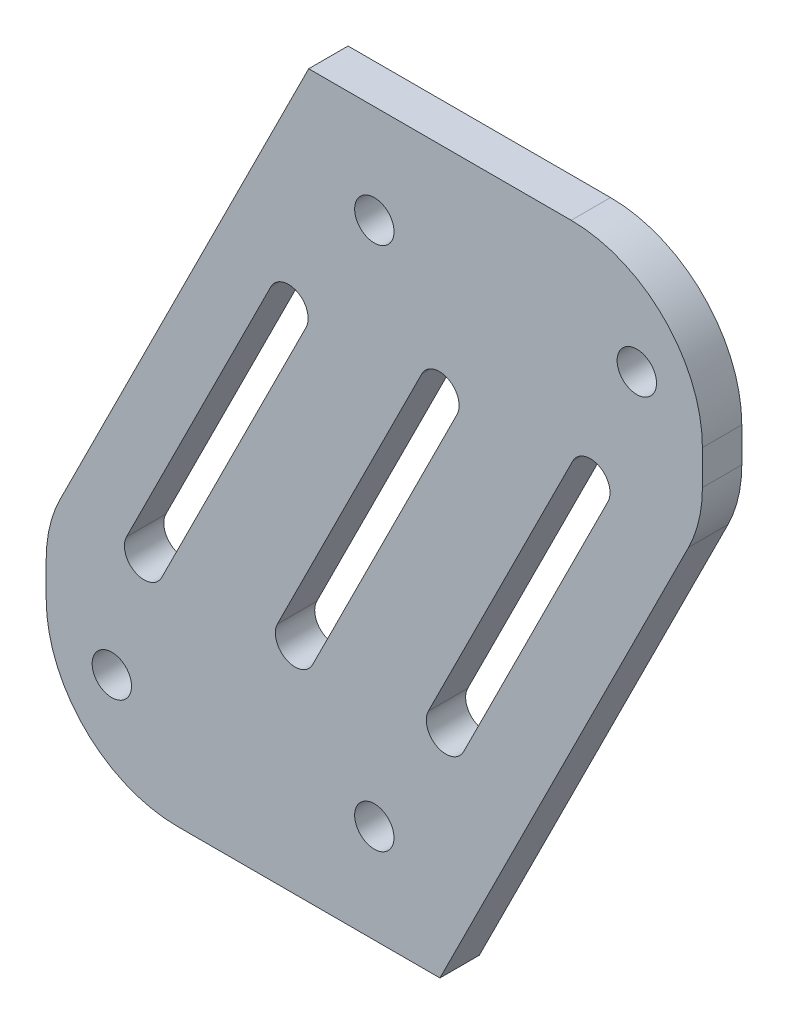
ISO-10303-21;
HEADER;
FILE_DESCRIPTION(('STEP AP214'),'2;1');
FILE_NAME('part.step','',(''),(''),'','','');
FILE_SCHEMA(('AUTOMOTIVE_DESIGN { 1 0 10303 214 1 1 1 1 }'));
ENDSEC;
DATA;
#1=APPLICATION_CONTEXT('core data for automotive mechanical design processes');
#2=APPLICATION_PROTOCOL_DEFINITION('international standard','automotive_design',2000,#1);
#3=PRODUCT_CONTEXT('',#1,'mechanical');
#4=PRODUCT('Part','Part','',(#3));
#5=PRODUCT_RELATED_PRODUCT_CATEGORY('part','',(#4));
#6=PRODUCT_DEFINITION_FORMATION('','',#4);
#7=PRODUCT_DEFINITION_CONTEXT('part definition',#1,'design');
#8=PRODUCT_DEFINITION('design','',#6,#7);
#9=PRODUCT_DEFINITION_SHAPE('','',#8);
#10=(LENGTH_UNIT() NAMED_UNIT(*) SI_UNIT(.MILLI.,.METRE.));
#11=(NAMED_UNIT(*) PLANE_ANGLE_UNIT() SI_UNIT($,.RADIAN.));
#12=(NAMED_UNIT(*) SI_UNIT($,.STERADIAN.) SOLID_ANGLE_UNIT());
#13=UNCERTAINTY_MEASURE_WITH_UNIT(LENGTH_MEASURE(1.E-05),#10,'distance_accuracy_value','');
#14=(GEOMETRIC_REPRESENTATION_CONTEXT(3) GLOBAL_UNCERTAINTY_ASSIGNED_CONTEXT((#13)) GLOBAL_UNIT_ASSIGNED_CONTEXT((#10,
#11,#12)) REPRESENTATION_CONTEXT('',''));
#15=CARTESIAN_POINT('',(0.,0.,0.));
#16=DIRECTION('',(0.,0.,1.));
#17=DIRECTION('',(1.,0.,0.));
#18=AXIS2_PLACEMENT_3D('',#15,#16,#17);
#19=CARTESIAN_POINT('',(-20.,-40.,3.));
#20=DIRECTION('',(-0.894427190999916,0.447213595499958,0.));
#21=DIRECTION('',(-0.447213595499958,-0.894427190999916,0.));
#22=AXIS2_PLACEMENT_3D('',#19,#20,#21);
#23=PLANE('',#22);
#24=DIRECTION('',(0.447213595499958,0.894427190999916,0.));
#25=VECTOR('',#24,1.);
#26=CARTESIAN_POINT('',(-20.,-40.,0.));
#27=LINE('',#26,#25);
#28=CARTESIAN_POINT('',(-20.,-40.,0.));
#29=VERTEX_POINT('',#28);
#30=CARTESIAN_POINT('',(-1.05572809000084,-2.11145618000168,0.));
#31=VERTEX_POINT('',#30);
#32=EDGE_CURVE('E330',#29,#31,#27,.T.);
#33=ORIENTED_EDGE('',*,*,#32,.T.);
#34=DIRECTION('',(0.,0.,-1.));
#35=VECTOR('',#34,1.);
#36=CARTESIAN_POINT('',(-1.05572809000085,-2.11145618000168,3.));
#37=LINE('',#36,#35);
#38=CARTESIAN_POINT('',(-1.05572809000084,-2.11145618000168,3.));
#39=VERTEX_POINT('',#38);
#40=EDGE_CURVE('E432',#31,#39,#37,.F.);
#41=ORIENTED_EDGE('',*,*,#40,.T.);
#42=DIRECTION('',(0.447213595499958,0.894427190999916,0.));
#43=VECTOR('',#42,1.);
#44=CARTESIAN_POINT('',(-20.,-40.,3.));
#45=LINE('',#44,#43);
#46=CARTESIAN_POINT('',(-20.,-40.,3.));
#47=VERTEX_POINT('',#46);
#48=EDGE_CURVE('E358',#47,#39,#45,.T.);
#49=ORIENTED_EDGE('',*,*,#48,.F.);
#50=DIRECTION('',(0.,0.,-1.));
#51=VECTOR('',#50,1.);
#52=CARTESIAN_POINT('',(-20.,-40.,3.));
#53=LINE('',#52,#51);
#54=EDGE_CURVE('E381',#47,#29,#53,.T.);
#55=ORIENTED_EDGE('',*,*,#54,.T.);
#56=EDGE_LOOP('',(#33,#41,#49,#55));
#57=FACE_BOUND('',#56,.T.);
#58=ADVANCED_FACE('F39',(#57),#23,.F.);
#59=CARTESIAN_POINT('',(0.,0.,3.));
#60=DIRECTION('',(-1.,0.,0.));
#61=DIRECTION('',(0.,0.,1.));
#62=AXIS2_PLACEMENT_3D('',#59,#60,#61);
#63=PLANE('',#62);
#64=DIRECTION('',(0.,1.,0.));
#65=VECTOR('',#64,1.);
#66=CARTESIAN_POINT('',(0.,0.,0.));
#67=LINE('',#66,#65);
#68=CARTESIAN_POINT('',(0.,2.36067977499789,0.));
#69=VERTEX_POINT('',#68);
#70=CARTESIAN_POINT('',(0.,5.,0.));
#71=VERTEX_POINT('',#70);
#72=EDGE_CURVE('E385',#69,#71,#67,.T.);
#73=ORIENTED_EDGE('',*,*,#72,.T.);
#74=DIRECTION('',(0.,0.,-1.));
#75=VECTOR('',#74,1.);
#76=CARTESIAN_POINT('',(0.,5.,3.));
#77=LINE('',#76,#75);
#78=CARTESIAN_POINT('',(0.,5.,3.));
#79=VERTEX_POINT('',#78);
#80=EDGE_CURVE('E11',#71,#79,#77,.F.);
#81=ORIENTED_EDGE('',*,*,#80,.T.);
#82=DIRECTION('',(0.,1.,0.));
#83=VECTOR('',#82,1.);
#84=CARTESIAN_POINT('',(0.,0.,3.));
#85=LINE('',#84,#83);
#86=CARTESIAN_POINT('',(0.,2.36067977499789,3.));
#87=VERTEX_POINT('',#86);
#88=EDGE_CURVE('E362',#87,#79,#85,.T.);
#89=ORIENTED_EDGE('',*,*,#88,.F.);
#90=DIRECTION('',(0.,0.,-1.));
#91=VECTOR('',#90,1.);
#92=CARTESIAN_POINT('',(0.,2.36067977499789,3.));
#93=LINE('',#92,#91);
#94=EDGE_CURVE('E428',#87,#69,#93,.T.);
#95=ORIENTED_EDGE('',*,*,#94,.T.);
#96=EDGE_LOOP('',(#73,#81,#89,#95));
#97=FACE_BOUND('',#96,.T.);
#98=ADVANCED_FACE('F500',(#97),#63,.F.);
#99=CARTESIAN_POINT('',(0.,15.,3.));
#100=DIRECTION('',(0.,-1.,0.));
#101=DIRECTION('',(1.,0.,0.));
#102=AXIS2_PLACEMENT_3D('',#99,#100,#101);
#103=PLANE('',#102);
#104=DIRECTION('',(-1.,0.,0.));
#105=VECTOR('',#104,1.);
#106=CARTESIAN_POINT('',(0.,15.,3.));
#107=LINE('',#106,#105);
#108=CARTESIAN_POINT('',(-10.,15.,3.));
#109=VERTEX_POINT('',#108);
#110=CARTESIAN_POINT('',(-30.,15.,3.));
#111=VERTEX_POINT('',#110);
#112=EDGE_CURVE('E367',#109,#111,#107,.T.);
#113=ORIENTED_EDGE('',*,*,#112,.F.);
#114=DIRECTION('',(0.,0.,-1.));
#115=VECTOR('',#114,1.);
#116=CARTESIAN_POINT('',(-10.,15.,3.));
#117=LINE('',#116,#115);
#118=CARTESIAN_POINT('',(-10.,15.,0.));
#119=VERTEX_POINT('',#118);
#120=EDGE_CURVE('E48',#109,#119,#117,.T.);
#121=ORIENTED_EDGE('',*,*,#120,.T.);
#122=DIRECTION('',(-1.,0.,0.));
#123=VECTOR('',#122,1.);
#124=CARTESIAN_POINT('',(0.,15.,0.));
#125=LINE('',#124,#123);
#126=CARTESIAN_POINT('',(-30.,15.,0.));
#127=VERTEX_POINT('',#126);
#128=EDGE_CURVE('E389',#119,#127,#125,.T.);
#129=ORIENTED_EDGE('',*,*,#128,.T.);
#130=DIRECTION('',(0.,0.,-1.));
#131=VECTOR('',#130,1.);
#132=CARTESIAN_POINT('',(-30.,15.,3.));
#133=LINE('',#132,#131);
#134=EDGE_CURVE('E405',#111,#127,#133,.T.);
#135=ORIENTED_EDGE('',*,*,#134,.F.);
#136=EDGE_LOOP('',(#113,#121,#129,#135));
#137=FACE_BOUND('',#136,.T.);
#138=ADVANCED_FACE('F459',(#137),#103,.F.);
#139=CARTESIAN_POINT('',(-30.,15.,3.));
#140=DIRECTION('',(0.894427190999916,-0.447213595499958,0.));
#141=DIRECTION('',(0.447213595499958,0.894427190999916,0.));
#142=AXIS2_PLACEMENT_3D('',#139,#140,#141);
#143=PLANE('',#142);
#144=DIRECTION('',(-0.447213595499958,-0.894427190999916,0.));
#145=VECTOR('',#144,1.);
#146=CARTESIAN_POINT('',(-30.,15.,0.));
#147=LINE('',#146,#145);
#148=CARTESIAN_POINT('',(-48.9442719099991,-22.8885438199983,0.));
#149=VERTEX_POINT('',#148);
#150=EDGE_CURVE('E392',#127,#149,#147,.T.);
#151=ORIENTED_EDGE('',*,*,#150,.T.);
#152=DIRECTION('',(0.,0.,-1.));
#153=VECTOR('',#152,1.);
#154=CARTESIAN_POINT('',(-48.9442719099991,-22.8885438199983,3.));
#155=LINE('',#154,#153);
#156=CARTESIAN_POINT('',(-48.9442719099991,-22.8885438199983,3.));
#157=VERTEX_POINT('',#156);
#158=EDGE_CURVE('E419',#149,#157,#155,.F.);
#159=ORIENTED_EDGE('',*,*,#158,.T.);
#160=DIRECTION('',(-0.447213595499958,-0.894427190999916,0.));
#161=VECTOR('',#160,1.);
#162=CARTESIAN_POINT('',(-30.,15.,3.));
#163=LINE('',#162,#161);
#164=EDGE_CURVE('E370',#111,#157,#163,.T.);
#165=ORIENTED_EDGE('',*,*,#164,.F.);
#166=ORIENTED_EDGE('',*,*,#134,.T.);
#167=EDGE_LOOP('',(#151,#159,#165,#166));
#168=FACE_BOUND('',#167,.T.);
#169=ADVANCED_FACE('F470',(#168),#143,.F.);
#170=CARTESIAN_POINT('',(-50.,-25.,3.));
#171=DIRECTION('',(1.,0.,0.));
#172=DIRECTION('',(0.,0.,-1.));
#173=AXIS2_PLACEMENT_3D('',#170,#171,#172);
#174=PLANE('',#173);
#175=DIRECTION('',(0.,-1.,0.));
#176=VECTOR('',#175,1.);
#177=CARTESIAN_POINT('',(-50.,-25.,0.));
#178=LINE('',#177,#176);
#179=CARTESIAN_POINT('',(-50.,-27.3606797749979,0.));
#180=VERTEX_POINT('',#179);
#181=CARTESIAN_POINT('',(-50.,-30.,0.));
#182=VERTEX_POINT('',#181);
#183=EDGE_CURVE('E396',#180,#182,#178,.T.);
#184=ORIENTED_EDGE('',*,*,#183,.T.);
#185=DIRECTION('',(0.,0.,-1.));
#186=VECTOR('',#185,1.);
#187=CARTESIAN_POINT('',(-50.,-30.,3.));
#188=LINE('',#187,#186);
#189=CARTESIAN_POINT('',(-50.,-30.,3.));
#190=VERTEX_POINT('',#189);
#191=EDGE_CURVE('E445',#182,#190,#188,.F.);
#192=ORIENTED_EDGE('',*,*,#191,.T.);
#193=DIRECTION('',(0.,-1.,0.));
#194=VECTOR('',#193,1.);
#195=CARTESIAN_POINT('',(-50.,-25.,3.));
#196=LINE('',#195,#194);
#197=CARTESIAN_POINT('',(-50.,-27.3606797749979,3.));
#198=VERTEX_POINT('',#197);
#199=EDGE_CURVE('E374',#198,#190,#196,.T.);
#200=ORIENTED_EDGE('',*,*,#199,.F.);
#201=DIRECTION('',(0.,0.,-1.));
#202=VECTOR('',#201,1.);
#203=CARTESIAN_POINT('',(-50.,-27.3606797749979,3.));
#204=LINE('',#203,#202);
#205=EDGE_CURVE('E409',#198,#180,#204,.T.);
#206=ORIENTED_EDGE('',*,*,#205,.T.);
#207=EDGE_LOOP('',(#184,#192,#200,#206));
#208=FACE_BOUND('',#207,.T.);
#209=ADVANCED_FACE('F481',(#208),#174,.F.);
#210=CARTESIAN_POINT('',(-50.,-40.,3.));
#211=DIRECTION('',(0.,1.,0.));
#212=DIRECTION('',(0.,0.,1.));
#213=AXIS2_PLACEMENT_3D('',#210,#211,#212);
#214=PLANE('',#213);
#215=DIRECTION('',(1.,0.,0.));
#216=VECTOR('',#215,1.);
#217=CARTESIAN_POINT('',(-50.,-40.,3.));
#218=LINE('',#217,#216);
#219=CARTESIAN_POINT('',(-40.,-40.,3.));
#220=VERTEX_POINT('',#219);
#221=EDGE_CURVE('E378',#220,#47,#218,.T.);
#222=ORIENTED_EDGE('',*,*,#221,.F.);
#223=DIRECTION('',(0.,0.,-1.));
#224=VECTOR('',#223,1.);
#225=CARTESIAN_POINT('',(-40.,-40.,3.));
#226=LINE('',#225,#224);
#227=CARTESIAN_POINT('',(-40.,-40.,0.));
#228=VERTEX_POINT('',#227);
#229=EDGE_CURVE('E435',#220,#228,#226,.T.);
#230=ORIENTED_EDGE('',*,*,#229,.T.);
#231=DIRECTION('',(1.,0.,0.));
#232=VECTOR('',#231,1.);
#233=CARTESIAN_POINT('',(-50.,-40.,0.));
#234=LINE('',#233,#232);
#235=EDGE_CURVE('E363',#228,#29,#234,.T.);
#236=ORIENTED_EDGE('',*,*,#235,.T.);
#237=ORIENTED_EDGE('',*,*,#54,.F.);
#238=EDGE_LOOP('',(#222,#230,#236,#237));
#239=FACE_BOUND('',#238,.T.);
#240=ADVANCED_FACE('F489',(#239),#214,.F.);
#241=CARTESIAN_POINT('',(0.,0.,3.));
#242=DIRECTION('',(0.,0.,1.));
#243=DIRECTION('',(1.,0.,0.));
#244=AXIS2_PLACEMENT_3D('',#241,#242,#243);
#245=PLANE('',#244);
#246=CARTESIAN_POINT('',(-31.0417960675006,-23.5,3.));
#247=DIRECTION('',(0.,0.,1.));
#248=DIRECTION('',(1.,0.,0.));
#249=AXIS2_PLACEMENT_3D('',#246,#247,#248);
#250=CIRCLE('',#249,1.5);
#251=CARTESIAN_POINT('',(-32.3834368540005,-22.8291796067501,3.));
#252=VERTEX_POINT('',#251);
#253=CARTESIAN_POINT('',(-29.7001552810008,-24.1708203932499,3.));
#254=VERTEX_POINT('',#253);
#255=EDGE_CURVE('E55',#252,#254,#250,.T.);
#256=ORIENTED_EDGE('',*,*,#255,.F.);
#257=DIRECTION('',(-0.447213595499957,-0.894427190999916,0.));
#258=VECTOR('',#257,1.);
#259=CARTESIAN_POINT('',(-32.3834368540005,-22.8291796067501,3.));
#260=LINE('',#259,#258);
#261=CARTESIAN_POINT('',(-21.3834368540005,-0.829179606750062,3.));
#262=VERTEX_POINT('',#261);
#263=EDGE_CURVE('E244',#262,#252,#260,.T.);
#264=ORIENTED_EDGE('',*,*,#263,.F.);
#265=CARTESIAN_POINT('',(-20.0417960675006,-1.5,3.));
#266=DIRECTION('',(0.,0.,1.));
#267=DIRECTION('',(1.,0.,0.));
#268=AXIS2_PLACEMENT_3D('',#265,#266,#267);
#269=CIRCLE('',#268,1.50000000000001);
#270=CARTESIAN_POINT('',(-18.7001552810008,-2.17082039324994,3.));
#271=VERTEX_POINT('',#270);
#272=EDGE_CURVE('E263',#271,#262,#269,.T.);
#273=ORIENTED_EDGE('',*,*,#272,.F.);
#274=DIRECTION('',(0.447213595499958,0.894427190999916,0.));
#275=VECTOR('',#274,1.);
#276=CARTESIAN_POINT('',(-29.7001552810008,-24.1708203932499,3.));
#277=LINE('',#276,#275);
#278=EDGE_CURVE('E259',#254,#271,#277,.T.);
#279=ORIENTED_EDGE('',*,*,#278,.F.);
#280=EDGE_LOOP('',(#256,#264,#273,#279));
#281=FACE_BOUND('',#280,.T.);
#282=CARTESIAN_POINT('',(-19.5417960675006,-23.5,3.));
#283=DIRECTION('',(0.,0.,1.));
#284=DIRECTION('',(1.,0.,0.));
#285=AXIS2_PLACEMENT_3D('',#282,#283,#284);
#286=CIRCLE('',#285,1.5);
#287=CARTESIAN_POINT('',(-20.8834368540005,-22.8291796067501,3.));
#288=VERTEX_POINT('',#287);
#289=CARTESIAN_POINT('',(-18.2001552810008,-24.1708203932499,3.));
#290=VERTEX_POINT('',#289);
#291=EDGE_CURVE('E63',#288,#290,#286,.T.);
#292=ORIENTED_EDGE('',*,*,#291,.F.);
#293=DIRECTION('',(-0.447213595499957,-0.894427190999916,0.));
#294=VECTOR('',#293,1.);
#295=CARTESIAN_POINT('',(-20.8834368540005,-22.8291796067501,3.));
#296=LINE('',#295,#294);
#297=CARTESIAN_POINT('',(-9.88343685400052,-0.82917960675006,3.));
#298=VERTEX_POINT('',#297);
#299=EDGE_CURVE('E212',#298,#288,#296,.T.);
#300=ORIENTED_EDGE('',*,*,#299,.F.);
#301=CARTESIAN_POINT('',(-8.54179606750064,-1.5,3.));
#302=DIRECTION('',(0.,0.,1.));
#303=DIRECTION('',(1.,0.,0.));
#304=AXIS2_PLACEMENT_3D('',#301,#302,#303);
#305=CIRCLE('',#304,1.50000000000001);
#306=CARTESIAN_POINT('',(-7.20015528100076,-2.17082039324994,3.));
#307=VERTEX_POINT('',#306);
#308=EDGE_CURVE('E216',#307,#298,#305,.T.);
#309=ORIENTED_EDGE('',*,*,#308,.F.);
#310=DIRECTION('',(0.447213595499958,0.894427190999916,0.));
#311=VECTOR('',#310,1.);
#312=CARTESIAN_POINT('',(-18.2001552810008,-24.1708203932499,3.));
#313=LINE('',#312,#311);
#314=EDGE_CURVE('E225',#290,#307,#313,.T.);
#315=ORIENTED_EDGE('',*,*,#314,.F.);
#316=EDGE_LOOP('',(#292,#300,#309,#315));
#317=FACE_BOUND('',#316,.T.);
#318=CARTESIAN_POINT('',(-42.5417960675006,-23.5,3.));
#319=DIRECTION('',(0.,0.,1.));
#320=DIRECTION('',(1.,0.,0.));
#321=AXIS2_PLACEMENT_3D('',#318,#319,#320);
#322=CIRCLE('',#321,1.5);
#323=CARTESIAN_POINT('',(-43.8834368540005,-22.8291796067501,3.));
#324=VERTEX_POINT('',#323);
#325=CARTESIAN_POINT('',(-41.2001552810007,-24.17082039325,3.));
#326=VERTEX_POINT('',#325);
#327=EDGE_CURVE('E273',#324,#326,#322,.T.);
#328=ORIENTED_EDGE('',*,*,#327,.F.);
#329=DIRECTION('',(-0.447213595499957,-0.894427190999916,0.));
#330=VECTOR('',#329,1.);
#331=CARTESIAN_POINT('',(-43.8834368540005,-22.8291796067501,3.));
#332=LINE('',#331,#330);
#333=CARTESIAN_POINT('',(-32.8834368540005,-0.829179606750064,3.));
#334=VERTEX_POINT('',#333);
#335=EDGE_CURVE('E287',#334,#324,#332,.T.);
#336=ORIENTED_EDGE('',*,*,#335,.F.);
#337=CARTESIAN_POINT('',(-31.5417960675006,-1.5,3.));
#338=DIRECTION('',(0.,0.,1.));
#339=DIRECTION('',(1.,0.,0.));
#340=AXIS2_PLACEMENT_3D('',#337,#338,#339);
#341=CIRCLE('',#340,1.50000000000001);
#342=CARTESIAN_POINT('',(-30.2001552810008,-2.17082039324994,3.));
#343=VERTEX_POINT('',#342);
#344=EDGE_CURVE('E306',#343,#334,#341,.T.);
#345=ORIENTED_EDGE('',*,*,#344,.F.);
#346=DIRECTION('',(0.447213595499958,0.894427190999916,0.));
#347=VECTOR('',#346,1.);
#348=CARTESIAN_POINT('',(-41.2001552810007,-24.1708203932499,3.));
#349=LINE('',#348,#347);
#350=EDGE_CURVE('E302',#326,#343,#349,.T.);
#351=ORIENTED_EDGE('',*,*,#350,.F.);
#352=EDGE_LOOP('',(#328,#336,#345,#351));
#353=FACE_BOUND('',#352,.T.);
#354=CARTESIAN_POINT('',(-5.,7.5,3.));
#355=DIRECTION('',(0.,0.,1.));
#356=DIRECTION('',(1.,0.,0.));
#357=AXIS2_PLACEMENT_3D('',#354,#355,#356);
#358=CIRCLE('',#357,1.5);
#359=CARTESIAN_POINT('',(-3.5,7.5,3.));
#360=VERTEX_POINT('',#359);
#361=EDGE_CURVE('E331',#360,#360,#358,.T.);
#362=ORIENTED_EDGE('',*,*,#361,.F.);
#363=EDGE_LOOP('',(#362));
#364=FACE_BOUND('',#363,.T.);
#365=CARTESIAN_POINT('',(-25.,-32.5,3.));
#366=DIRECTION('',(0.,0.,1.));
#367=DIRECTION('',(1.,0.,0.));
#368=AXIS2_PLACEMENT_3D('',#365,#366,#367);
#369=CIRCLE('',#368,1.5);
#370=CARTESIAN_POINT('',(-23.5,-32.5,3.));
#371=VERTEX_POINT('',#370);
#372=EDGE_CURVE('E316',#371,#371,#369,.T.);
#373=ORIENTED_EDGE('',*,*,#372,.F.);
#374=EDGE_LOOP('',(#373));
#375=FACE_BOUND('',#374,.T.);
#376=CARTESIAN_POINT('',(-45.,-32.5,3.));
#377=DIRECTION('',(0.,0.,1.));
#378=DIRECTION('',(1.,0.,0.));
#379=AXIS2_PLACEMENT_3D('',#376,#377,#378);
#380=CIRCLE('',#379,1.5);
#381=CARTESIAN_POINT('',(-43.5,-32.5,3.));
#382=VERTEX_POINT('',#381);
#383=EDGE_CURVE('E340',#382,#382,#380,.T.);
#384=ORIENTED_EDGE('',*,*,#383,.F.);
#385=EDGE_LOOP('',(#384));
#386=FACE_BOUND('',#385,.T.);
#387=CARTESIAN_POINT('',(-25.,7.5,3.));
#388=DIRECTION('',(0.,0.,1.));
#389=DIRECTION('',(1.,0.,0.));
#390=AXIS2_PLACEMENT_3D('',#387,#388,#389);
#391=CIRCLE('',#390,1.5);
#392=CARTESIAN_POINT('',(-23.5,7.5,3.));
#393=VERTEX_POINT('',#392);
#394=EDGE_CURVE('E347',#393,#393,#391,.T.);
#395=ORIENTED_EDGE('',*,*,#394,.F.);
#396=EDGE_LOOP('',(#395));
#397=FACE_BOUND('',#396,.T.);
#398=ORIENTED_EDGE('',*,*,#199,.T.);
#399=CARTESIAN_POINT('',(-40.,-30.,3.));
#400=DIRECTION('',(0.,0.,1.));
#401=DIRECTION('',(1.,0.,0.));
#402=AXIS2_PLACEMENT_3D('',#399,#400,#401);
#403=CIRCLE('',#402,10.);
#404=EDGE_CURVE('E451',#190,#220,#403,.T.);
#405=ORIENTED_EDGE('',*,*,#404,.T.);
#406=ORIENTED_EDGE('',*,*,#221,.T.);
#407=ORIENTED_EDGE('',*,*,#48,.T.);
#408=CARTESIAN_POINT('',(-10.,2.36067977499789,3.));
#409=DIRECTION('',(0.,0.,1.));
#410=DIRECTION('',(1.,0.,0.));
#411=AXIS2_PLACEMENT_3D('',#408,#409,#410);
#412=CIRCLE('',#411,10.);
#413=EDGE_CURVE('E422',#39,#87,#412,.T.);
#414=ORIENTED_EDGE('',*,*,#413,.T.);
#415=ORIENTED_EDGE('',*,*,#88,.T.);
#416=CARTESIAN_POINT('',(-10.,5.,3.));
#417=DIRECTION('',(0.,0.,1.));
#418=DIRECTION('',(1.,0.,0.));
#419=AXIS2_PLACEMENT_3D('',#416,#417,#418);
#420=CIRCLE('',#419,10.);
#421=EDGE_CURVE('E448',#79,#109,#420,.T.);
#422=ORIENTED_EDGE('',*,*,#421,.T.);
#423=ORIENTED_EDGE('',*,*,#112,.T.);
#424=ORIENTED_EDGE('',*,*,#164,.T.);
#425=CARTESIAN_POINT('',(-40.,-27.3606797749979,3.));
#426=DIRECTION('',(0.,0.,1.));
#427=DIRECTION('',(1.,0.,0.));
#428=AXIS2_PLACEMENT_3D('',#425,#426,#427);
#429=CIRCLE('',#428,10.);
#430=EDGE_CURVE('E425',#157,#198,#429,.T.);
#431=ORIENTED_EDGE('',*,*,#430,.T.);
#432=EDGE_LOOP('',(#398,#405,#406,#407,#414,#415,#422,#423,#424,#431));
#433=FACE_BOUND('',#432,.T.);
#434=ADVANCED_FACE('F478',(#281,#317,#353,#364,#375,#386,#397,#433),#245,.T.);
#435=CARTESIAN_POINT('',(0.,0.,0.));
#436=DIRECTION('',(0.,0.,1.));
#437=DIRECTION('',(1.,0.,0.));
#438=AXIS2_PLACEMENT_3D('',#435,#436,#437);
#439=PLANE('',#438);
#440=DIRECTION('',(-0.447213595499957,-0.894427190999916,0.));
#441=VECTOR('',#440,1.);
#442=CARTESIAN_POINT('',(-32.3834368540005,-22.8291796067501,0.));
#443=LINE('',#442,#441);
#444=CARTESIAN_POINT('',(-21.3834368540005,-0.829179606750062,0.));
#445=VERTEX_POINT('',#444);
#446=CARTESIAN_POINT('',(-32.3834368540005,-22.8291796067501,0.));
#447=VERTEX_POINT('',#446);
#448=EDGE_CURVE('E252',#445,#447,#443,.T.);
#449=ORIENTED_EDGE('',*,*,#448,.T.);
#450=CARTESIAN_POINT('',(-31.0417960675006,-23.5,0.));
#451=DIRECTION('',(0.,0.,1.));
#452=DIRECTION('',(1.,0.,0.));
#453=AXIS2_PLACEMENT_3D('',#450,#451,#452);
#454=CIRCLE('',#453,1.5);
#455=CARTESIAN_POINT('',(-29.7001552810008,-24.1708203932499,0.));
#456=VERTEX_POINT('',#455);
#457=EDGE_CURVE('E239',#447,#456,#454,.T.);
#458=ORIENTED_EDGE('',*,*,#457,.T.);
#459=DIRECTION('',(0.447213595499958,0.894427190999916,0.));
#460=VECTOR('',#459,1.);
#461=CARTESIAN_POINT('',(-29.7001552810008,-24.1708203932499,0.));
#462=LINE('',#461,#460);
#463=CARTESIAN_POINT('',(-18.7001552810008,-2.17082039324994,0.));
#464=VERTEX_POINT('',#463);
#465=EDGE_CURVE('E243',#456,#464,#462,.T.);
#466=ORIENTED_EDGE('',*,*,#465,.T.);
#467=CARTESIAN_POINT('',(-20.0417960675006,-1.5,0.));
#468=DIRECTION('',(0.,0.,1.));
#469=DIRECTION('',(1.,0.,0.));
#470=AXIS2_PLACEMENT_3D('',#467,#468,#469);
#471=CIRCLE('',#470,1.50000000000001);
#472=EDGE_CURVE('E248',#464,#445,#471,.T.);
#473=ORIENTED_EDGE('',*,*,#472,.T.);
#474=EDGE_LOOP('',(#449,#458,#466,#473));
#475=FACE_BOUND('',#474,.T.);
#476=DIRECTION('',(-0.447213595499957,-0.894427190999916,0.));
#477=VECTOR('',#476,1.);
#478=CARTESIAN_POINT('',(-20.8834368540005,-22.8291796067501,0.));
#479=LINE('',#478,#477);
#480=CARTESIAN_POINT('',(-9.88343685400052,-0.82917960675006,0.));
#481=VERTEX_POINT('',#480);
#482=CARTESIAN_POINT('',(-20.8834368540005,-22.8291796067501,0.));
#483=VERTEX_POINT('',#482);
#484=EDGE_CURVE('E197',#481,#483,#479,.T.);
#485=ORIENTED_EDGE('',*,*,#484,.T.);
#486=CARTESIAN_POINT('',(-19.5417960675006,-23.5,0.));
#487=DIRECTION('',(0.,0.,1.));
#488=DIRECTION('',(1.,0.,0.));
#489=AXIS2_PLACEMENT_3D('',#486,#487,#488);
#490=CIRCLE('',#489,1.5);
#491=CARTESIAN_POINT('',(-18.2001552810008,-24.1708203932499,0.));
#492=VERTEX_POINT('',#491);
#493=EDGE_CURVE('E190',#483,#492,#490,.T.);
#494=ORIENTED_EDGE('',*,*,#493,.T.);
#495=DIRECTION('',(0.447213595499958,0.894427190999916,0.));
#496=VECTOR('',#495,1.);
#497=CARTESIAN_POINT('',(-18.2001552810008,-24.1708203932499,0.));
#498=LINE('',#497,#496);
#499=CARTESIAN_POINT('',(-7.20015528100076,-2.17082039324994,0.));
#500=VERTEX_POINT('',#499);
#501=EDGE_CURVE('E201',#492,#500,#498,.T.);
#502=ORIENTED_EDGE('',*,*,#501,.T.);
#503=CARTESIAN_POINT('',(-8.54179606750064,-1.5,0.));
#504=DIRECTION('',(0.,0.,1.));
#505=DIRECTION('',(1.,0.,0.));
#506=AXIS2_PLACEMENT_3D('',#503,#504,#505);
#507=CIRCLE('',#506,1.50000000000001);
#508=EDGE_CURVE('E206',#500,#481,#507,.T.);
#509=ORIENTED_EDGE('',*,*,#508,.T.);
#510=EDGE_LOOP('',(#485,#494,#502,#509));
#511=FACE_BOUND('',#510,.T.);
#512=DIRECTION('',(-0.447213595499957,-0.894427190999916,0.));
#513=VECTOR('',#512,1.);
#514=CARTESIAN_POINT('',(-43.8834368540005,-22.8291796067501,0.));
#515=LINE('',#514,#513);
#516=CARTESIAN_POINT('',(-32.8834368540005,-0.829179606750064,0.));
#517=VERTEX_POINT('',#516);
#518=CARTESIAN_POINT('',(-43.8834368540005,-22.8291796067501,0.));
#519=VERTEX_POINT('',#518);
#520=EDGE_CURVE('E295',#517,#519,#515,.T.);
#521=ORIENTED_EDGE('',*,*,#520,.T.);
#522=CARTESIAN_POINT('',(-42.5417960675006,-23.5,0.));
#523=DIRECTION('',(0.,0.,1.));
#524=DIRECTION('',(1.,0.,0.));
#525=AXIS2_PLACEMENT_3D('',#522,#523,#524);
#526=CIRCLE('',#525,1.5);
#527=CARTESIAN_POINT('',(-41.2001552810007,-24.1708203932499,0.));
#528=VERTEX_POINT('',#527);
#529=EDGE_CURVE('E282',#519,#528,#526,.T.);
#530=ORIENTED_EDGE('',*,*,#529,.T.);
#531=DIRECTION('',(0.447213595499958,0.894427190999916,0.));
#532=VECTOR('',#531,1.);
#533=CARTESIAN_POINT('',(-41.2001552810007,-24.1708203932499,0.));
#534=LINE('',#533,#532);
#535=CARTESIAN_POINT('',(-30.2001552810007,-2.17082039324994,0.));
#536=VERTEX_POINT('',#535);
#537=EDGE_CURVE('E286',#528,#536,#534,.T.);
#538=ORIENTED_EDGE('',*,*,#537,.T.);
#539=CARTESIAN_POINT('',(-31.5417960675006,-1.5,0.));
#540=DIRECTION('',(0.,0.,1.));
#541=DIRECTION('',(1.,0.,0.));
#542=AXIS2_PLACEMENT_3D('',#539,#540,#541);
#543=CIRCLE('',#542,1.50000000000001);
#544=EDGE_CURVE('E291',#536,#517,#543,.T.);
#545=ORIENTED_EDGE('',*,*,#544,.T.);
#546=EDGE_LOOP('',(#521,#530,#538,#545));
#547=FACE_BOUND('',#546,.T.);
#548=CARTESIAN_POINT('',(-5.,7.5,0.));
#549=DIRECTION('',(0.,0.,1.));
#550=DIRECTION('',(1.,0.,0.));
#551=AXIS2_PLACEMENT_3D('',#548,#549,#550);
#552=CIRCLE('',#551,1.5);
#553=CARTESIAN_POINT('',(-3.5,7.5,0.));
#554=VERTEX_POINT('',#553);
#555=EDGE_CURVE('E326',#554,#554,#552,.T.);
#556=ORIENTED_EDGE('',*,*,#555,.T.);
#557=EDGE_LOOP('',(#556));
#558=FACE_BOUND('',#557,.T.);
#559=CARTESIAN_POINT('',(-25.,-32.5,0.));
#560=DIRECTION('',(0.,0.,1.));
#561=DIRECTION('',(1.,0.,0.));
#562=AXIS2_PLACEMENT_3D('',#559,#560,#561);
#563=CIRCLE('',#562,1.5);
#564=CARTESIAN_POINT('',(-23.5,-32.5,0.));
#565=VERTEX_POINT('',#564);
#566=EDGE_CURVE('E336',#565,#565,#563,.T.);
#567=ORIENTED_EDGE('',*,*,#566,.T.);
#568=EDGE_LOOP('',(#567));
#569=FACE_BOUND('',#568,.T.);
#570=CARTESIAN_POINT('',(-45.,-32.5,0.));
#571=DIRECTION('',(0.,0.,1.));
#572=DIRECTION('',(1.,0.,0.));
#573=AXIS2_PLACEMENT_3D('',#570,#571,#572);
#574=CIRCLE('',#573,1.5);
#575=CARTESIAN_POINT('',(-43.5,-32.5,0.));
#576=VERTEX_POINT('',#575);
#577=EDGE_CURVE('E351',#576,#576,#574,.T.);
#578=ORIENTED_EDGE('',*,*,#577,.T.);
#579=EDGE_LOOP('',(#578));
#580=FACE_BOUND('',#579,.T.);
#581=CARTESIAN_POINT('',(-25.,7.5,0.));
#582=DIRECTION('',(0.,0.,1.));
#583=DIRECTION('',(1.,0.,0.));
#584=AXIS2_PLACEMENT_3D('',#581,#582,#583);
#585=CIRCLE('',#584,1.5);
#586=CARTESIAN_POINT('',(-23.5,7.5,0.));
#587=VERTEX_POINT('',#586);
#588=EDGE_CURVE('E335',#587,#587,#585,.T.);
#589=ORIENTED_EDGE('',*,*,#588,.T.);
#590=EDGE_LOOP('',(#589));
#591=FACE_BOUND('',#590,.T.);
#592=ORIENTED_EDGE('',*,*,#235,.F.);
#593=CARTESIAN_POINT('',(-40.,-30.,0.));
#594=DIRECTION('',(0.,0.,1.));
#595=DIRECTION('',(1.,0.,0.));
#596=AXIS2_PLACEMENT_3D('',#593,#594,#595);
#597=CIRCLE('',#596,10.);
#598=EDGE_CURVE('E442',#228,#182,#597,.F.);
#599=ORIENTED_EDGE('',*,*,#598,.T.);
#600=ORIENTED_EDGE('',*,*,#183,.F.);
#601=CARTESIAN_POINT('',(-40.,-27.3606797749979,0.));
#602=DIRECTION('',(0.,0.,1.));
#603=DIRECTION('',(1.,0.,0.));
#604=AXIS2_PLACEMENT_3D('',#601,#602,#603);
#605=CIRCLE('',#604,10.);
#606=EDGE_CURVE('E416',#180,#149,#605,.F.);
#607=ORIENTED_EDGE('',*,*,#606,.T.);
#608=ORIENTED_EDGE('',*,*,#150,.F.);
#609=ORIENTED_EDGE('',*,*,#128,.F.);
#610=CARTESIAN_POINT('',(-10.,5.,0.));
#611=DIRECTION('',(0.,0.,1.));
#612=DIRECTION('',(1.,0.,0.));
#613=AXIS2_PLACEMENT_3D('',#610,#611,#612);
#614=CIRCLE('',#613,10.);
#615=EDGE_CURVE('E439',#119,#71,#614,.F.);
#616=ORIENTED_EDGE('',*,*,#615,.T.);
#617=ORIENTED_EDGE('',*,*,#72,.F.);
#618=CARTESIAN_POINT('',(-10.,2.36067977499789,0.));
#619=DIRECTION('',(0.,0.,1.));
#620=DIRECTION('',(1.,0.,0.));
#621=AXIS2_PLACEMENT_3D('',#618,#619,#620);
#622=CIRCLE('',#621,10.);
#623=EDGE_CURVE('E413',#69,#31,#622,.F.);
#624=ORIENTED_EDGE('',*,*,#623,.T.);
#625=ORIENTED_EDGE('',*,*,#32,.F.);
#626=EDGE_LOOP('',(#592,#599,#600,#607,#608,#609,#616,#617,#624,#625));
#627=FACE_BOUND('',#626,.T.);
#628=ADVANCED_FACE('F208',(#475,#511,#547,#558,#569,#580,#591,#627),#439,.F.);
#629=CARTESIAN_POINT('',(-25.,7.5,0.));
#630=DIRECTION('',(0.,0.,1.));
#631=DIRECTION('',(1.,0.,0.));
#632=AXIS2_PLACEMENT_3D('',#629,#630,#631);
#633=CYLINDRICAL_SURFACE('',#632,1.5);
#634=ORIENTED_EDGE('',*,*,#588,.F.);
#635=EDGE_LOOP('',(#634));
#636=FACE_BOUND('',#635,.T.);
#637=ORIENTED_EDGE('',*,*,#394,.T.);
#638=EDGE_LOOP('',(#637));
#639=FACE_BOUND('',#638,.T.);
#640=ADVANCED_FACE('F561',(#636,#639),#633,.F.);
#641=CARTESIAN_POINT('',(-45.,-32.5,0.));
#642=DIRECTION('',(0.,0.,1.));
#643=DIRECTION('',(1.,0.,0.));
#644=AXIS2_PLACEMENT_3D('',#641,#642,#643);
#645=CYLINDRICAL_SURFACE('',#644,1.5);
#646=ORIENTED_EDGE('',*,*,#577,.F.);
#647=EDGE_LOOP('',(#646));
#648=FACE_BOUND('',#647,.T.);
#649=ORIENTED_EDGE('',*,*,#383,.T.);
#650=EDGE_LOOP('',(#649));
#651=FACE_BOUND('',#650,.T.);
#652=ADVANCED_FACE('F683',(#648,#651),#645,.F.);
#653=CARTESIAN_POINT('',(-25.,-32.5,0.));
#654=DIRECTION('',(0.,0.,1.));
#655=DIRECTION('',(1.,0.,0.));
#656=AXIS2_PLACEMENT_3D('',#653,#654,#655);
#657=CYLINDRICAL_SURFACE('',#656,1.5);
#658=ORIENTED_EDGE('',*,*,#566,.F.);
#659=EDGE_LOOP('',(#658));
#660=FACE_BOUND('',#659,.T.);
#661=ORIENTED_EDGE('',*,*,#372,.T.);
#662=EDGE_LOOP('',(#661));
#663=FACE_BOUND('',#662,.T.);
#664=ADVANCED_FACE('F679',(#660,#663),#657,.F.);
#665=CARTESIAN_POINT('',(-5.,7.5,0.));
#666=DIRECTION('',(0.,0.,1.));
#667=DIRECTION('',(1.,0.,0.));
#668=AXIS2_PLACEMENT_3D('',#665,#666,#667);
#669=CYLINDRICAL_SURFACE('',#668,1.5);
#670=ORIENTED_EDGE('',*,*,#555,.F.);
#671=EDGE_LOOP('',(#670));
#672=FACE_BOUND('',#671,.T.);
#673=ORIENTED_EDGE('',*,*,#361,.T.);
#674=EDGE_LOOP('',(#673));
#675=FACE_BOUND('',#674,.T.);
#676=ADVANCED_FACE('F521',(#672,#675),#669,.F.);
#677=CARTESIAN_POINT('',(-40.,-27.3606797749979,3.));
#678=DIRECTION('',(0.,0.,-1.));
#679=DIRECTION('',(-1.,0.,0.));
#680=AXIS2_PLACEMENT_3D('',#677,#678,#679);
#681=CYLINDRICAL_SURFACE('',#680,10.);
#682=ORIENTED_EDGE('',*,*,#430,.F.);
#683=ORIENTED_EDGE('',*,*,#158,.F.);
#684=ORIENTED_EDGE('',*,*,#606,.F.);
#685=ORIENTED_EDGE('',*,*,#205,.F.);
#686=EDGE_LOOP('',(#682,#683,#684,#685));
#687=FACE_BOUND('',#686,.T.);
#688=ADVANCED_FACE('F474',(#687),#681,.T.);
#689=CARTESIAN_POINT('',(-10.,2.36067977499789,3.));
#690=DIRECTION('',(0.,0.,-1.));
#691=DIRECTION('',(-1.,0.,0.));
#692=AXIS2_PLACEMENT_3D('',#689,#690,#691);
#693=CYLINDRICAL_SURFACE('',#692,10.);
#694=ORIENTED_EDGE('',*,*,#413,.F.);
#695=ORIENTED_EDGE('',*,*,#40,.F.);
#696=ORIENTED_EDGE('',*,*,#623,.F.);
#697=ORIENTED_EDGE('',*,*,#94,.F.);
#698=EDGE_LOOP('',(#694,#695,#696,#697));
#699=FACE_BOUND('',#698,.T.);
#700=ADVANCED_FACE('F498',(#699),#693,.T.);
#701=CARTESIAN_POINT('',(-40.,-30.,3.));
#702=DIRECTION('',(0.,0.,-1.));
#703=DIRECTION('',(-1.,0.,0.));
#704=AXIS2_PLACEMENT_3D('',#701,#702,#703);
#705=CYLINDRICAL_SURFACE('',#704,10.);
#706=ORIENTED_EDGE('',*,*,#404,.F.);
#707=ORIENTED_EDGE('',*,*,#191,.F.);
#708=ORIENTED_EDGE('',*,*,#598,.F.);
#709=ORIENTED_EDGE('',*,*,#229,.F.);
#710=EDGE_LOOP('',(#706,#707,#708,#709));
#711=FACE_BOUND('',#710,.T.);
#712=ADVANCED_FACE('F484',(#711),#705,.T.);
#713=CARTESIAN_POINT('',(-10.,5.,3.));
#714=DIRECTION('',(0.,0.,-1.));
#715=DIRECTION('',(-1.,0.,0.));
#716=AXIS2_PLACEMENT_3D('',#713,#714,#715);
#717=CYLINDRICAL_SURFACE('',#716,10.);
#718=ORIENTED_EDGE('',*,*,#421,.F.);
#719=ORIENTED_EDGE('',*,*,#80,.F.);
#720=ORIENTED_EDGE('',*,*,#615,.F.);
#721=ORIENTED_EDGE('',*,*,#120,.F.);
#722=EDGE_LOOP('',(#718,#719,#720,#721));
#723=FACE_BOUND('',#722,.T.);
#724=ADVANCED_FACE('F41',(#723),#717,.T.);
#725=CARTESIAN_POINT('',(-42.5417960675006,-23.5,0.));
#726=DIRECTION('',(0.,0.,1.));
#727=DIRECTION('',(1.,0.,0.));
#728=AXIS2_PLACEMENT_3D('',#725,#726,#727);
#729=CYLINDRICAL_SURFACE('',#728,1.5);
#730=ORIENTED_EDGE('',*,*,#327,.T.);
#731=DIRECTION('',(0.,0.,1.));
#732=VECTOR('',#731,1.);
#733=CARTESIAN_POINT('',(-41.2001552810007,-24.1708203932499,0.));
#734=LINE('',#733,#732);
#735=EDGE_CURVE('E299',#528,#326,#734,.T.);
#736=ORIENTED_EDGE('',*,*,#735,.F.);
#737=ORIENTED_EDGE('',*,*,#529,.F.);
#738=DIRECTION('',(0.,0.,1.));
#739=VECTOR('',#738,1.);
#740=CARTESIAN_POINT('',(-43.8834368540005,-22.8291796067501,0.));
#741=LINE('',#740,#739);
#742=EDGE_CURVE('E313',#519,#324,#741,.T.);
#743=ORIENTED_EDGE('',*,*,#742,.T.);
#744=EDGE_LOOP('',(#730,#736,#737,#743));
#745=FACE_BOUND('',#744,.T.);
#746=ADVANCED_FACE('F503',(#745),#729,.F.);
#747=CARTESIAN_POINT('',(-43.8834368540005,-22.8291796067501,0.));
#748=DIRECTION('',(-0.894427190999916,0.447213595499957,0.));
#749=DIRECTION('',(-0.447213595499957,-0.894427190999916,0.));
#750=AXIS2_PLACEMENT_3D('',#747,#748,#749);
#751=PLANE('',#750);
#752=ORIENTED_EDGE('',*,*,#335,.T.);
#753=ORIENTED_EDGE('',*,*,#742,.F.);
#754=ORIENTED_EDGE('',*,*,#520,.F.);
#755=DIRECTION('',(0.,0.,1.));
#756=VECTOR('',#755,1.);
#757=CARTESIAN_POINT('',(-32.8834368540005,-0.829179606750064,0.));
#758=LINE('',#757,#756);
#759=EDGE_CURVE('E317',#517,#334,#758,.T.);
#760=ORIENTED_EDGE('',*,*,#759,.T.);
#761=EDGE_LOOP('',(#752,#753,#754,#760));
#762=FACE_BOUND('',#761,.T.);
#763=ADVANCED_FACE('F508',(#762),#751,.F.);
#764=CARTESIAN_POINT('',(-31.5417960675006,-1.5,0.));
#765=DIRECTION('',(0.,0.,1.));
#766=DIRECTION('',(1.,0.,0.));
#767=AXIS2_PLACEMENT_3D('',#764,#765,#766);
#768=CYLINDRICAL_SURFACE('',#767,1.50000000000001);
#769=ORIENTED_EDGE('',*,*,#344,.T.);
#770=ORIENTED_EDGE('',*,*,#759,.F.);
#771=ORIENTED_EDGE('',*,*,#544,.F.);
#772=DIRECTION('',(0.,0.,1.));
#773=VECTOR('',#772,1.);
#774=CARTESIAN_POINT('',(-30.2001552810008,-2.17082039324994,0.));
#775=LINE('',#774,#773);
#776=EDGE_CURVE('E320',#536,#343,#775,.T.);
#777=ORIENTED_EDGE('',*,*,#776,.T.);
#778=EDGE_LOOP('',(#769,#770,#771,#777));
#779=FACE_BOUND('',#778,.T.);
#780=ADVANCED_FACE('F578',(#779),#768,.F.);
#781=CARTESIAN_POINT('',(-41.2001552810007,-24.1708203932499,0.));
#782=DIRECTION('',(0.894427190999916,-0.447213595499958,0.));
#783=DIRECTION('',(0.447213595499958,0.894427190999916,0.));
#784=AXIS2_PLACEMENT_3D('',#781,#782,#783);
#785=PLANE('',#784);
#786=ORIENTED_EDGE('',*,*,#350,.T.);
#787=ORIENTED_EDGE('',*,*,#776,.F.);
#788=ORIENTED_EDGE('',*,*,#537,.F.);
#789=ORIENTED_EDGE('',*,*,#735,.T.);
#790=EDGE_LOOP('',(#786,#787,#788,#789));
#791=FACE_BOUND('',#790,.T.);
#792=ADVANCED_FACE('F588',(#791),#785,.F.);
#793=CARTESIAN_POINT('',(-19.5417960675006,-23.5,0.));
#794=DIRECTION('',(0.,0.,1.));
#795=DIRECTION('',(1.,0.,0.));
#796=AXIS2_PLACEMENT_3D('',#793,#794,#795);
#797=CYLINDRICAL_SURFACE('',#796,1.5);
#798=ORIENTED_EDGE('',*,*,#291,.T.);
#799=DIRECTION('',(0.,0.,1.));
#800=VECTOR('',#799,1.);
#801=CARTESIAN_POINT('',(-18.2001552810008,-24.1708203932499,0.));
#802=LINE('',#801,#800);
#803=EDGE_CURVE('E186',#492,#290,#802,.T.);
#804=ORIENTED_EDGE('',*,*,#803,.F.);
#805=ORIENTED_EDGE('',*,*,#493,.F.);
#806=DIRECTION('',(0.,0.,1.));
#807=VECTOR('',#806,1.);
#808=CARTESIAN_POINT('',(-20.8834368540005,-22.8291796067501,0.));
#809=LINE('',#808,#807);
#810=EDGE_CURVE('E231',#483,#288,#809,.T.);
#811=ORIENTED_EDGE('',*,*,#810,.T.);
#812=EDGE_LOOP('',(#798,#804,#805,#811));
#813=FACE_BOUND('',#812,.T.);
#814=ADVANCED_FACE('F188',(#813),#797,.F.);
#815=CARTESIAN_POINT('',(-20.8834368540005,-22.8291796067501,0.));
#816=DIRECTION('',(-0.894427190999916,0.447213595499957,0.));
#817=DIRECTION('',(-0.447213595499957,-0.894427190999916,0.));
#818=AXIS2_PLACEMENT_3D('',#815,#816,#817);
#819=PLANE('',#818);
#820=ORIENTED_EDGE('',*,*,#299,.T.);
#821=ORIENTED_EDGE('',*,*,#810,.F.);
#822=ORIENTED_EDGE('',*,*,#484,.F.);
#823=DIRECTION('',(0.,0.,1.));
#824=VECTOR('',#823,1.);
#825=CARTESIAN_POINT('',(-9.88343685400052,-0.82917960675006,0.));
#826=LINE('',#825,#824);
#827=EDGE_CURVE('E234',#481,#298,#826,.T.);
#828=ORIENTED_EDGE('',*,*,#827,.T.);
#829=EDGE_LOOP('',(#820,#821,#822,#828));
#830=FACE_BOUND('',#829,.T.);
#831=ADVANCED_FACE('F607',(#830),#819,.F.);
#832=CARTESIAN_POINT('',(-8.54179606750064,-1.5,0.));
#833=DIRECTION('',(0.,0.,1.));
#834=DIRECTION('',(1.,0.,0.));
#835=AXIS2_PLACEMENT_3D('',#832,#833,#834);
#836=CYLINDRICAL_SURFACE('',#835,1.50000000000001);
#837=ORIENTED_EDGE('',*,*,#308,.T.);
#838=ORIENTED_EDGE('',*,*,#827,.F.);
#839=ORIENTED_EDGE('',*,*,#508,.F.);
#840=DIRECTION('',(0.,0.,1.));
#841=VECTOR('',#840,1.);
#842=CARTESIAN_POINT('',(-7.20015528100076,-2.17082039324994,0.));
#843=LINE('',#842,#841);
#844=EDGE_CURVE('E196',#500,#307,#843,.T.);
#845=ORIENTED_EDGE('',*,*,#844,.T.);
#846=EDGE_LOOP('',(#837,#838,#839,#845));
#847=FACE_BOUND('',#846,.T.);
#848=ADVANCED_FACE('F616',(#847),#836,.F.);
#849=CARTESIAN_POINT('',(-18.2001552810008,-24.1708203932499,0.));
#850=DIRECTION('',(0.894427190999916,-0.447213595499958,0.));
#851=DIRECTION('',(0.447213595499958,0.894427190999916,0.));
#852=AXIS2_PLACEMENT_3D('',#849,#850,#851);
#853=PLANE('',#852);
#854=ORIENTED_EDGE('',*,*,#314,.T.);
#855=ORIENTED_EDGE('',*,*,#844,.F.);
#856=ORIENTED_EDGE('',*,*,#501,.F.);
#857=ORIENTED_EDGE('',*,*,#803,.T.);
#858=EDGE_LOOP('',(#854,#855,#856,#857));
#859=FACE_BOUND('',#858,.T.);
#860=ADVANCED_FACE('F202',(#859),#853,.F.);
#861=CARTESIAN_POINT('',(-31.0417960675006,-23.5,0.));
#862=DIRECTION('',(0.,0.,1.));
#863=DIRECTION('',(1.,0.,0.));
#864=AXIS2_PLACEMENT_3D('',#861,#862,#863);
#865=CYLINDRICAL_SURFACE('',#864,1.5);
#866=ORIENTED_EDGE('',*,*,#255,.T.);
#867=DIRECTION('',(0.,0.,1.));
#868=VECTOR('',#867,1.);
#869=CARTESIAN_POINT('',(-29.7001552810008,-24.1708203932499,0.));
#870=LINE('',#869,#868);
#871=EDGE_CURVE('E256',#456,#254,#870,.T.);
#872=ORIENTED_EDGE('',*,*,#871,.F.);
#873=ORIENTED_EDGE('',*,*,#457,.F.);
#874=DIRECTION('',(0.,0.,1.));
#875=VECTOR('',#874,1.);
#876=CARTESIAN_POINT('',(-32.3834368540005,-22.8291796067501,0.));
#877=LINE('',#876,#875);
#878=EDGE_CURVE('E270',#447,#252,#877,.T.);
#879=ORIENTED_EDGE('',*,*,#878,.T.);
#880=EDGE_LOOP('',(#866,#872,#873,#879));
#881=FACE_BOUND('',#880,.T.);
#882=ADVANCED_FACE('F635',(#881),#865,.F.);
#883=CARTESIAN_POINT('',(-32.3834368540005,-22.8291796067501,0.));
#884=DIRECTION('',(-0.894427190999916,0.447213595499957,0.));
#885=DIRECTION('',(-0.447213595499957,-0.894427190999916,0.));
#886=AXIS2_PLACEMENT_3D('',#883,#884,#885);
#887=PLANE('',#886);
#888=ORIENTED_EDGE('',*,*,#263,.T.);
#889=ORIENTED_EDGE('',*,*,#878,.F.);
#890=ORIENTED_EDGE('',*,*,#448,.F.);
#891=DIRECTION('',(0.,0.,1.));
#892=VECTOR('',#891,1.);
#893=CARTESIAN_POINT('',(-21.3834368540005,-0.829179606750062,0.));
#894=LINE('',#893,#892);
#895=EDGE_CURVE('E274',#445,#262,#894,.T.);
#896=ORIENTED_EDGE('',*,*,#895,.T.);
#897=EDGE_LOOP('',(#888,#889,#890,#896));
#898=FACE_BOUND('',#897,.T.);
#899=ADVANCED_FACE('F644',(#898),#887,.F.);
#900=CARTESIAN_POINT('',(-20.0417960675006,-1.5,0.));
#901=DIRECTION('',(0.,0.,1.));
#902=DIRECTION('',(1.,0.,0.));
#903=AXIS2_PLACEMENT_3D('',#900,#901,#902);
#904=CYLINDRICAL_SURFACE('',#903,1.50000000000001);
#905=ORIENTED_EDGE('',*,*,#272,.T.);
#906=ORIENTED_EDGE('',*,*,#895,.F.);
#907=ORIENTED_EDGE('',*,*,#472,.F.);
#908=DIRECTION('',(0.,0.,1.));
#909=VECTOR('',#908,1.);
#910=CARTESIAN_POINT('',(-18.7001552810008,-2.17082039324994,0.));
#911=LINE('',#910,#909);
#912=EDGE_CURVE('E277',#464,#271,#911,.T.);
#913=ORIENTED_EDGE('',*,*,#912,.T.);
#914=EDGE_LOOP('',(#905,#906,#907,#913));
#915=FACE_BOUND('',#914,.T.);
#916=ADVANCED_FACE('F653',(#915),#904,.F.);
#917=CARTESIAN_POINT('',(-29.7001552810008,-24.1708203932499,0.));
#918=DIRECTION('',(0.894427190999916,-0.447213595499958,0.));
#919=DIRECTION('',(0.447213595499958,0.894427190999916,0.));
#920=AXIS2_PLACEMENT_3D('',#917,#918,#919);
#921=PLANE('',#920);
#922=ORIENTED_EDGE('',*,*,#278,.T.);
#923=ORIENTED_EDGE('',*,*,#912,.F.);
#924=ORIENTED_EDGE('',*,*,#465,.F.);
#925=ORIENTED_EDGE('',*,*,#871,.T.);
#926=EDGE_LOOP('',(#922,#923,#924,#925));
#927=FACE_BOUND('',#926,.T.);
#928=ADVANCED_FACE('F663',(#927),#921,.F.);
#929=CLOSED_SHELL('',(#58,#98,#138,#169,#209,#240,#434,#628,#640,#652,#664,#676,#688,#700,#712,
#724,#746,#763,#780,#792,#814,#831,#848,#860,#882,#899,#916,#928));
#930=MANIFOLD_SOLID_BREP('B2',#929);
#931=ADVANCED_BREP_SHAPE_REPRESENTATION('',(#18,#930),#14);
#932=SHAPE_DEFINITION_REPRESENTATION(#9,#931);
ENDSEC;
END-ISO-10303-21;
